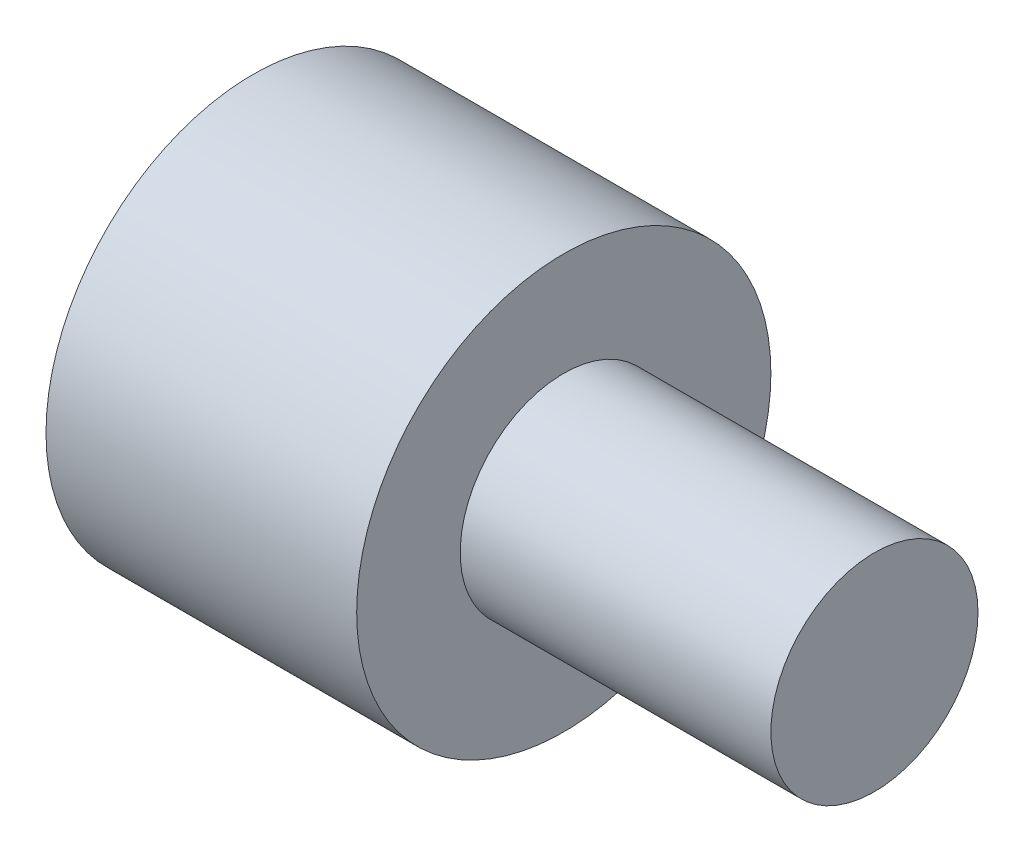
ISO-10303-21;
HEADER;
FILE_DESCRIPTION(('STEP AP214'),'2;1');
FILE_NAME('part.step','',(''),(''),'','','');
FILE_SCHEMA(('AUTOMOTIVE_DESIGN { 1 0 10303 214 1 1 1 1 }'));
ENDSEC;
DATA;
#1=APPLICATION_CONTEXT('core data for automotive mechanical design processes');
#2=APPLICATION_PROTOCOL_DEFINITION('international standard','automotive_design',2000,#1);
#3=PRODUCT_CONTEXT('',#1,'mechanical');
#4=PRODUCT('Part','Part','',(#3));
#5=PRODUCT_RELATED_PRODUCT_CATEGORY('part','',(#4));
#6=PRODUCT_DEFINITION_FORMATION('','',#4);
#7=PRODUCT_DEFINITION_CONTEXT('part definition',#1,'design');
#8=PRODUCT_DEFINITION('design','',#6,#7);
#9=PRODUCT_DEFINITION_SHAPE('','',#8);
#10=(LENGTH_UNIT() NAMED_UNIT(*) SI_UNIT(.MILLI.,.METRE.));
#11=(NAMED_UNIT(*) PLANE_ANGLE_UNIT() SI_UNIT($,.RADIAN.));
#12=(NAMED_UNIT(*) SI_UNIT($,.STERADIAN.) SOLID_ANGLE_UNIT());
#13=UNCERTAINTY_MEASURE_WITH_UNIT(LENGTH_MEASURE(1.E-05),#10,'distance_accuracy_value','');
#14=(GEOMETRIC_REPRESENTATION_CONTEXT(3) GLOBAL_UNCERTAINTY_ASSIGNED_CONTEXT((#13)) GLOBAL_UNIT_ASSIGNED_CONTEXT((#10,
#11,#12)) REPRESENTATION_CONTEXT('',''));
#15=CARTESIAN_POINT('',(0.,0.,0.));
#16=DIRECTION('',(0.,0.,1.));
#17=DIRECTION('',(1.,0.,0.));
#18=AXIS2_PLACEMENT_3D('',#15,#16,#17);
#19=CARTESIAN_POINT('',(30.,0.,0.));
#20=DIRECTION('',(-1.,0.,0.));
#21=DIRECTION('',(0.,0.,1.));
#22=AXIS2_PLACEMENT_3D('',#19,#20,#21);
#23=CYLINDRICAL_SURFACE('',#22,20.);
#24=CARTESIAN_POINT('',(30.,0.,0.));
#25=DIRECTION('',(1.,0.,0.));
#26=DIRECTION('',(0.,0.,-1.));
#27=AXIS2_PLACEMENT_3D('',#24,#25,#26);
#28=CIRCLE('',#27,20.);
#29=CARTESIAN_POINT('',(30.,0.,-20.));
#30=VERTEX_POINT('',#29);
#31=EDGE_CURVE('E50',#30,#30,#28,.T.);
#32=ORIENTED_EDGE('',*,*,#31,.F.);
#33=EDGE_LOOP('',(#32));
#34=FACE_BOUND('',#33,.T.);
#35=CARTESIAN_POINT('',(0.,0.,0.));
#36=DIRECTION('',(1.,0.,0.));
#37=DIRECTION('',(0.,0.,-1.));
#38=AXIS2_PLACEMENT_3D('',#35,#36,#37);
#39=CIRCLE('',#38,20.);
#40=CARTESIAN_POINT('',(0.,0.,-20.));
#41=VERTEX_POINT('',#40);
#42=EDGE_CURVE('E46',#41,#41,#39,.T.);
#43=ORIENTED_EDGE('',*,*,#42,.T.);
#44=EDGE_LOOP('',(#43));
#45=FACE_BOUND('',#44,.T.);
#46=ADVANCED_FACE('F43',(#34,#45),#23,.T.);
#47=CARTESIAN_POINT('',(30.,0.,0.));
#48=DIRECTION('',(1.,0.,0.));
#49=DIRECTION('',(0.,0.,-1.));
#50=AXIS2_PLACEMENT_3D('',#47,#48,#49);
#51=PLANE('',#50);
#52=CARTESIAN_POINT('',(30.,0.,0.));
#53=DIRECTION('',(1.,0.,0.));
#54=DIRECTION('',(0.,0.,-1.));
#55=AXIS2_PLACEMENT_3D('',#52,#53,#54);
#56=CIRCLE('',#55,10.);
#57=CARTESIAN_POINT('',(30.,0.,-10.));
#58=VERTEX_POINT('',#57);
#59=EDGE_CURVE('E10',#58,#58,#56,.T.);
#60=ORIENTED_EDGE('',*,*,#59,.F.);
#61=EDGE_LOOP('',(#60));
#62=FACE_BOUND('',#61,.T.);
#63=ORIENTED_EDGE('',*,*,#31,.T.);
#64=EDGE_LOOP('',(#63));
#65=FACE_BOUND('',#64,.T.);
#66=ADVANCED_FACE('F67',(#62,#65),#51,.T.);
#67=CARTESIAN_POINT('',(0.,0.,0.));
#68=DIRECTION('',(1.,0.,0.));
#69=DIRECTION('',(0.,0.,-1.));
#70=AXIS2_PLACEMENT_3D('',#67,#68,#69);
#71=PLANE('',#70);
#72=ORIENTED_EDGE('',*,*,#42,.F.);
#73=EDGE_LOOP('',(#72));
#74=FACE_BOUND('',#73,.T.);
#75=ADVANCED_FACE('F64',(#74),#71,.F.);
#76=CARTESIAN_POINT('',(60.,0.,0.));
#77=DIRECTION('',(-1.,0.,0.));
#78=DIRECTION('',(0.,0.,1.));
#79=AXIS2_PLACEMENT_3D('',#76,#77,#78);
#80=CYLINDRICAL_SURFACE('',#79,10.);
#81=CARTESIAN_POINT('',(60.,0.,0.));
#82=DIRECTION('',(1.,0.,0.));
#83=DIRECTION('',(0.,0.,-1.));
#84=AXIS2_PLACEMENT_3D('',#81,#82,#83);
#85=CIRCLE('',#84,10.);
#86=CARTESIAN_POINT('',(60.,0.,-10.));
#87=VERTEX_POINT('',#86);
#88=EDGE_CURVE('E56',#87,#87,#85,.T.);
#89=ORIENTED_EDGE('',*,*,#88,.F.);
#90=EDGE_LOOP('',(#89));
#91=FACE_BOUND('',#90,.T.);
#92=ORIENTED_EDGE('',*,*,#59,.T.);
#93=EDGE_LOOP('',(#92));
#94=FACE_BOUND('',#93,.T.);
#95=ADVANCED_FACE('F66',(#91,#94),#80,.T.);
#96=CARTESIAN_POINT('',(60.,0.,0.));
#97=DIRECTION('',(1.,0.,0.));
#98=DIRECTION('',(0.,0.,-1.));
#99=AXIS2_PLACEMENT_3D('',#96,#97,#98);
#100=PLANE('',#99);
#101=ORIENTED_EDGE('',*,*,#88,.T.);
#102=EDGE_LOOP('',(#101));
#103=FACE_BOUND('',#102,.T.);
#104=ADVANCED_FACE('F72',(#103),#100,.T.);
#105=CLOSED_SHELL('',(#46,#66,#75,#95,#104));
#106=MANIFOLD_SOLID_BREP('B2',#105);
#107=ADVANCED_BREP_SHAPE_REPRESENTATION('',(#18,#106),#14);
#108=SHAPE_DEFINITION_REPRESENTATION(#9,#107);
ENDSEC;
END-ISO-10303-21;
